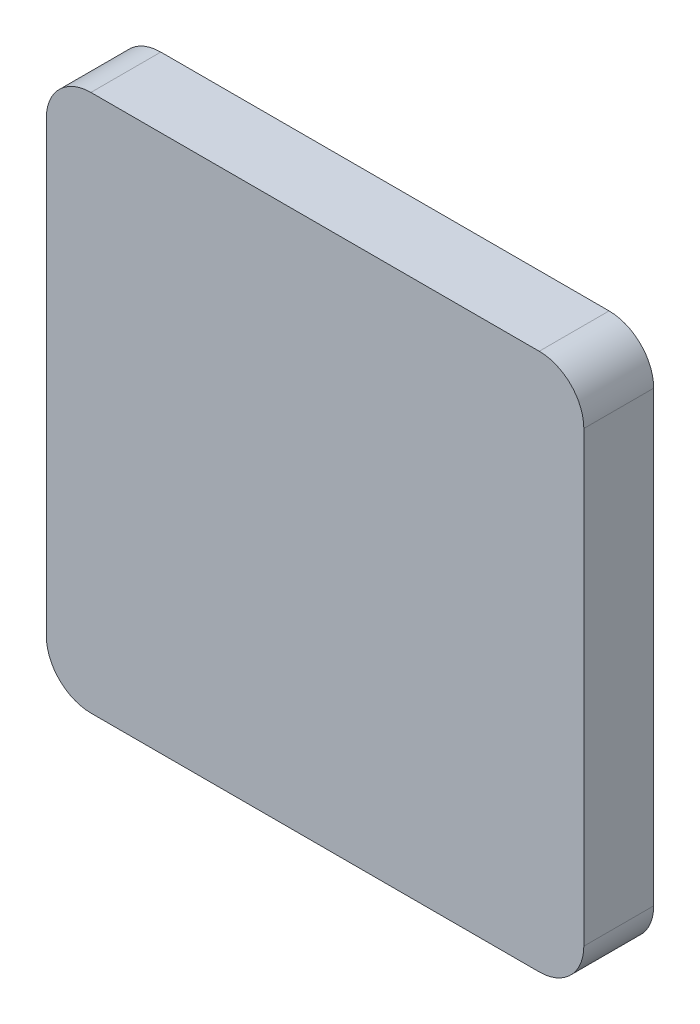
ISO-10303-21;
HEADER;
FILE_DESCRIPTION(('STEP AP214'),'2;1');
FILE_NAME('part.step','',(''),(''),'','','');
FILE_SCHEMA(('AUTOMOTIVE_DESIGN { 1 0 10303 214 1 1 1 1 }'));
ENDSEC;
DATA;
#1=APPLICATION_CONTEXT('core data for automotive mechanical design processes');
#2=APPLICATION_PROTOCOL_DEFINITION('international standard','automotive_design',2000,#1);
#3=PRODUCT_CONTEXT('',#1,'mechanical');
#4=PRODUCT('Part','Part','',(#3));
#5=PRODUCT_RELATED_PRODUCT_CATEGORY('part','',(#4));
#6=PRODUCT_DEFINITION_FORMATION('','',#4);
#7=PRODUCT_DEFINITION_CONTEXT('part definition',#1,'design');
#8=PRODUCT_DEFINITION('design','',#6,#7);
#9=PRODUCT_DEFINITION_SHAPE('','',#8);
#10=(LENGTH_UNIT() NAMED_UNIT(*) SI_UNIT(.MILLI.,.METRE.));
#11=(NAMED_UNIT(*) PLANE_ANGLE_UNIT() SI_UNIT($,.RADIAN.));
#12=(NAMED_UNIT(*) SI_UNIT($,.STERADIAN.) SOLID_ANGLE_UNIT());
#13=UNCERTAINTY_MEASURE_WITH_UNIT(LENGTH_MEASURE(1.E-05),#10,'distance_accuracy_value','');
#14=(GEOMETRIC_REPRESENTATION_CONTEXT(3) GLOBAL_UNCERTAINTY_ASSIGNED_CONTEXT((#13)) GLOBAL_UNIT_ASSIGNED_CONTEXT((#10,
#11,#12)) REPRESENTATION_CONTEXT('',''));
#15=CARTESIAN_POINT('',(0.,0.,0.));
#16=DIRECTION('',(0.,0.,1.));
#17=DIRECTION('',(1.,0.,0.));
#18=AXIS2_PLACEMENT_3D('',#15,#16,#17);
#19=CARTESIAN_POINT('',(-10.5918,-10.5918,3.302));
#20=DIRECTION('',(0.,0.,-1.));
#21=DIRECTION('',(-1.,0.,0.));
#22=AXIS2_PLACEMENT_3D('',#19,#20,#21);
#23=CYLINDRICAL_SURFACE('',#22,2.1082);
#24=CARTESIAN_POINT('',(-10.5918,-10.5918,0.));
#25=DIRECTION('',(0.,0.,1.));
#26=DIRECTION('',(1.,0.,0.));
#27=AXIS2_PLACEMENT_3D('',#24,#25,#26);
#28=CIRCLE('',#27,2.1082);
#29=CARTESIAN_POINT('',(-12.7,-10.5918,0.));
#30=VERTEX_POINT('',#29);
#31=CARTESIAN_POINT('',(-10.5918,-12.7,0.));
#32=VERTEX_POINT('',#31);
#33=EDGE_CURVE('E140',#30,#32,#28,.T.);
#34=ORIENTED_EDGE('',*,*,#33,.T.);
#35=DIRECTION('',(0.,0.,-1.));
#36=VECTOR('',#35,1.);
#37=CARTESIAN_POINT('',(-10.5918,-12.7,3.302));
#38=LINE('',#37,#36);
#39=CARTESIAN_POINT('',(-10.5918,-12.7,3.302));
#40=VERTEX_POINT('',#39);
#41=EDGE_CURVE('E11',#40,#32,#38,.T.);
#42=ORIENTED_EDGE('',*,*,#41,.F.);
#43=CARTESIAN_POINT('',(-10.5918,-10.5918,3.302));
#44=DIRECTION('',(0.,0.,1.));
#45=DIRECTION('',(1.,0.,0.));
#46=AXIS2_PLACEMENT_3D('',#43,#44,#45);
#47=CIRCLE('',#46,2.1082);
#48=CARTESIAN_POINT('',(-12.7,-10.5918,3.302));
#49=VERTEX_POINT('',#48);
#50=EDGE_CURVE('E162',#49,#40,#47,.T.);
#51=ORIENTED_EDGE('',*,*,#50,.F.);
#52=DIRECTION('',(0.,0.,-1.));
#53=VECTOR('',#52,1.);
#54=CARTESIAN_POINT('',(-12.7,-10.5918,3.302));
#55=LINE('',#54,#53);
#56=EDGE_CURVE('E136',#49,#30,#55,.T.);
#57=ORIENTED_EDGE('',*,*,#56,.T.);
#58=EDGE_LOOP('',(#34,#42,#51,#57));
#59=FACE_BOUND('',#58,.T.);
#60=ADVANCED_FACE('F39',(#59),#23,.T.);
#61=CARTESIAN_POINT('',(-10.5918,-12.7,3.302));
#62=DIRECTION('',(0.,1.,0.));
#63=DIRECTION('',(-1.,0.,0.));
#64=AXIS2_PLACEMENT_3D('',#61,#62,#63);
#65=PLANE('',#64);
#66=DIRECTION('',(1.,0.,0.));
#67=VECTOR('',#66,1.);
#68=CARTESIAN_POINT('',(-10.5918,-12.7,0.));
#69=LINE('',#68,#67);
#70=CARTESIAN_POINT('',(10.5918,-12.7,0.));
#71=VERTEX_POINT('',#70);
#72=EDGE_CURVE('E144',#32,#71,#69,.T.);
#73=ORIENTED_EDGE('',*,*,#72,.T.);
#74=DIRECTION('',(0.,0.,-1.));
#75=VECTOR('',#74,1.);
#76=CARTESIAN_POINT('',(10.5918,-12.7,3.302));
#77=LINE('',#76,#75);
#78=CARTESIAN_POINT('',(10.5918,-12.7,3.302));
#79=VERTEX_POINT('',#78);
#80=EDGE_CURVE('E48',#79,#71,#77,.T.);
#81=ORIENTED_EDGE('',*,*,#80,.F.);
#82=DIRECTION('',(1.,0.,0.));
#83=VECTOR('',#82,1.);
#84=CARTESIAN_POINT('',(-10.5918,-12.7,3.302));
#85=LINE('',#84,#83);
#86=EDGE_CURVE('E99',#40,#79,#85,.T.);
#87=ORIENTED_EDGE('',*,*,#86,.F.);
#88=ORIENTED_EDGE('',*,*,#41,.T.);
#89=EDGE_LOOP('',(#73,#81,#87,#88));
#90=FACE_BOUND('',#89,.T.);
#91=ADVANCED_FACE('F208',(#90),#65,.F.);
#92=CARTESIAN_POINT('',(10.5918,-10.5918,3.302));
#93=DIRECTION('',(0.,0.,-1.));
#94=DIRECTION('',(-1.,0.,0.));
#95=AXIS2_PLACEMENT_3D('',#92,#93,#94);
#96=CYLINDRICAL_SURFACE('',#95,2.10819999999999);
#97=CARTESIAN_POINT('',(10.5918,-10.5918,0.));
#98=DIRECTION('',(0.,0.,1.));
#99=DIRECTION('',(1.,0.,0.));
#100=AXIS2_PLACEMENT_3D('',#97,#98,#99);
#101=CIRCLE('',#100,2.10819999999999);
#102=CARTESIAN_POINT('',(12.7,-10.5918,0.));
#103=VERTEX_POINT('',#102);
#104=EDGE_CURVE('E147',#71,#103,#101,.T.);
#105=ORIENTED_EDGE('',*,*,#104,.T.);
#106=DIRECTION('',(0.,0.,-1.));
#107=VECTOR('',#106,1.);
#108=CARTESIAN_POINT('',(12.7,-10.5918,3.302));
#109=LINE('',#108,#107);
#110=CARTESIAN_POINT('',(12.7,-10.5918,3.302));
#111=VERTEX_POINT('',#110);
#112=EDGE_CURVE('E173',#111,#103,#109,.T.);
#113=ORIENTED_EDGE('',*,*,#112,.F.);
#114=CARTESIAN_POINT('',(10.5918,-10.5918,3.302));
#115=DIRECTION('',(0.,0.,1.));
#116=DIRECTION('',(1.,0.,0.));
#117=AXIS2_PLACEMENT_3D('',#114,#115,#116);
#118=CIRCLE('',#117,2.10819999999999);
#119=EDGE_CURVE('E183',#79,#111,#118,.T.);
#120=ORIENTED_EDGE('',*,*,#119,.F.);
#121=ORIENTED_EDGE('',*,*,#80,.T.);
#122=EDGE_LOOP('',(#105,#113,#120,#121));
#123=FACE_BOUND('',#122,.T.);
#124=ADVANCED_FACE('F181',(#123),#96,.T.);
#125=CARTESIAN_POINT('',(12.7,-10.5918,3.302));
#126=DIRECTION('',(-1.,0.,0.));
#127=DIRECTION('',(0.,0.,1.));
#128=AXIS2_PLACEMENT_3D('',#125,#126,#127);
#129=PLANE('',#128);
#130=DIRECTION('',(0.,1.,0.));
#131=VECTOR('',#130,1.);
#132=CARTESIAN_POINT('',(12.7,-10.5918,0.));
#133=LINE('',#132,#131);
#134=CARTESIAN_POINT('',(12.7,10.5918,0.));
#135=VERTEX_POINT('',#134);
#136=EDGE_CURVE('E150',#103,#135,#133,.T.);
#137=ORIENTED_EDGE('',*,*,#136,.T.);
#138=DIRECTION('',(0.,0.,-1.));
#139=VECTOR('',#138,1.);
#140=CARTESIAN_POINT('',(12.7,10.5918,3.302));
#141=LINE('',#140,#139);
#142=CARTESIAN_POINT('',(12.7,10.5918,3.302));
#143=VERTEX_POINT('',#142);
#144=EDGE_CURVE('E169',#143,#135,#141,.T.);
#145=ORIENTED_EDGE('',*,*,#144,.F.);
#146=DIRECTION('',(0.,1.,0.));
#147=VECTOR('',#146,1.);
#148=CARTESIAN_POINT('',(12.7,-10.5918,3.302));
#149=LINE('',#148,#147);
#150=EDGE_CURVE('E196',#111,#143,#149,.T.);
#151=ORIENTED_EDGE('',*,*,#150,.F.);
#152=ORIENTED_EDGE('',*,*,#112,.T.);
#153=EDGE_LOOP('',(#137,#145,#151,#152));
#154=FACE_BOUND('',#153,.T.);
#155=ADVANCED_FACE('F191',(#154),#129,.F.);
#156=CARTESIAN_POINT('',(10.5918,10.5918,3.302));
#157=DIRECTION('',(0.,0.,-1.));
#158=DIRECTION('',(-1.,0.,0.));
#159=AXIS2_PLACEMENT_3D('',#156,#157,#158);
#160=CYLINDRICAL_SURFACE('',#159,2.1082);
#161=CARTESIAN_POINT('',(10.5918,10.5918,0.));
#162=DIRECTION('',(0.,0.,1.));
#163=DIRECTION('',(1.,0.,0.));
#164=AXIS2_PLACEMENT_3D('',#161,#162,#163);
#165=CIRCLE('',#164,2.1082);
#166=CARTESIAN_POINT('',(10.5918,12.7,0.));
#167=VERTEX_POINT('',#166);
#168=EDGE_CURVE('E153',#135,#167,#165,.T.);
#169=ORIENTED_EDGE('',*,*,#168,.T.);
#170=DIRECTION('',(0.,0.,-1.));
#171=VECTOR('',#170,1.);
#172=CARTESIAN_POINT('',(10.5918,12.7,3.302));
#173=LINE('',#172,#171);
#174=CARTESIAN_POINT('',(10.5918,12.7,3.302));
#175=VERTEX_POINT('',#174);
#176=EDGE_CURVE('E129',#175,#167,#173,.T.);
#177=ORIENTED_EDGE('',*,*,#176,.F.);
#178=CARTESIAN_POINT('',(10.5918,10.5918,3.302));
#179=DIRECTION('',(0.,0.,1.));
#180=DIRECTION('',(1.,0.,0.));
#181=AXIS2_PLACEMENT_3D('',#178,#179,#180);
#182=CIRCLE('',#181,2.1082);
#183=EDGE_CURVE('E118',#143,#175,#182,.T.);
#184=ORIENTED_EDGE('',*,*,#183,.F.);
#185=ORIENTED_EDGE('',*,*,#144,.T.);
#186=EDGE_LOOP('',(#169,#177,#184,#185));
#187=FACE_BOUND('',#186,.T.);
#188=ADVANCED_FACE('F194',(#187),#160,.T.);
#189=CARTESIAN_POINT('',(10.5918,12.7,3.302));
#190=DIRECTION('',(0.,-1.,0.));
#191=DIRECTION('',(1.,0.,0.));
#192=AXIS2_PLACEMENT_3D('',#189,#190,#191);
#193=PLANE('',#192);
#194=DIRECTION('',(-1.,0.,0.));
#195=VECTOR('',#194,1.);
#196=CARTESIAN_POINT('',(10.5918,12.7,0.));
#197=LINE('',#196,#195);
#198=CARTESIAN_POINT('',(-10.5918,12.7,0.));
#199=VERTEX_POINT('',#198);
#200=EDGE_CURVE('E127',#167,#199,#197,.T.);
#201=ORIENTED_EDGE('',*,*,#200,.T.);
#202=DIRECTION('',(0.,0.,-1.));
#203=VECTOR('',#202,1.);
#204=CARTESIAN_POINT('',(-10.5918,12.7,3.302));
#205=LINE('',#204,#203);
#206=CARTESIAN_POINT('',(-10.5918,12.7,3.302));
#207=VERTEX_POINT('',#206);
#208=EDGE_CURVE('E124',#207,#199,#205,.T.);
#209=ORIENTED_EDGE('',*,*,#208,.F.);
#210=DIRECTION('',(-1.,0.,0.));
#211=VECTOR('',#210,1.);
#212=CARTESIAN_POINT('',(10.5918,12.7,3.302));
#213=LINE('',#212,#211);
#214=EDGE_CURVE('E112',#175,#207,#213,.T.);
#215=ORIENTED_EDGE('',*,*,#214,.F.);
#216=ORIENTED_EDGE('',*,*,#176,.T.);
#217=EDGE_LOOP('',(#201,#209,#215,#216));
#218=FACE_BOUND('',#217,.T.);
#219=ADVANCED_FACE('F125',(#218),#193,.F.);
#220=CARTESIAN_POINT('',(-10.5918,10.5918,3.302));
#221=DIRECTION('',(0.,0.,-1.));
#222=DIRECTION('',(-1.,0.,0.));
#223=AXIS2_PLACEMENT_3D('',#220,#221,#222);
#224=CYLINDRICAL_SURFACE('',#223,2.1082);
#225=CARTESIAN_POINT('',(-10.5918,10.5918,0.));
#226=DIRECTION('',(0.,0.,1.));
#227=DIRECTION('',(1.,0.,0.));
#228=AXIS2_PLACEMENT_3D('',#225,#226,#227);
#229=CIRCLE('',#228,2.1082);
#230=CARTESIAN_POINT('',(-12.7,10.5918,0.));
#231=VERTEX_POINT('',#230);
#232=EDGE_CURVE('E85',#199,#231,#229,.T.);
#233=ORIENTED_EDGE('',*,*,#232,.T.);
#234=DIRECTION('',(0.,0.,-1.));
#235=VECTOR('',#234,1.);
#236=CARTESIAN_POINT('',(-12.7,10.5918,3.302));
#237=LINE('',#236,#235);
#238=CARTESIAN_POINT('',(-12.7,10.5918,3.302));
#239=VERTEX_POINT('',#238);
#240=EDGE_CURVE('E130',#239,#231,#237,.T.);
#241=ORIENTED_EDGE('',*,*,#240,.F.);
#242=CARTESIAN_POINT('',(-10.5918,10.5918,3.302));
#243=DIRECTION('',(0.,0.,1.));
#244=DIRECTION('',(1.,0.,0.));
#245=AXIS2_PLACEMENT_3D('',#242,#243,#244);
#246=CIRCLE('',#245,2.1082);
#247=EDGE_CURVE('E116',#207,#239,#246,.T.);
#248=ORIENTED_EDGE('',*,*,#247,.F.);
#249=ORIENTED_EDGE('',*,*,#208,.T.);
#250=EDGE_LOOP('',(#233,#241,#248,#249));
#251=FACE_BOUND('',#250,.T.);
#252=ADVANCED_FACE('F132',(#251),#224,.T.);
#253=CARTESIAN_POINT('',(-12.7,10.5918,3.302));
#254=DIRECTION('',(1.,0.,0.));
#255=DIRECTION('',(0.,1.,0.));
#256=AXIS2_PLACEMENT_3D('',#253,#254,#255);
#257=PLANE('',#256);
#258=DIRECTION('',(0.,-1.,0.));
#259=VECTOR('',#258,1.);
#260=CARTESIAN_POINT('',(-12.7,10.5918,0.));
#261=LINE('',#260,#259);
#262=EDGE_CURVE('E91',#231,#30,#261,.T.);
#263=ORIENTED_EDGE('',*,*,#262,.T.);
#264=ORIENTED_EDGE('',*,*,#56,.F.);
#265=DIRECTION('',(0.,-1.,0.));
#266=VECTOR('',#265,1.);
#267=CARTESIAN_POINT('',(-12.7,10.5918,3.302));
#268=LINE('',#267,#266);
#269=EDGE_CURVE('E56',#239,#49,#268,.T.);
#270=ORIENTED_EDGE('',*,*,#269,.F.);
#271=ORIENTED_EDGE('',*,*,#240,.T.);
#272=EDGE_LOOP('',(#263,#264,#270,#271));
#273=FACE_BOUND('',#272,.T.);
#274=ADVANCED_FACE('F224',(#273),#257,.F.);
#275=CARTESIAN_POINT('',(-10.5918,-10.5918,3.302));
#276=DIRECTION('',(0.,0.,1.));
#277=DIRECTION('',(1.,0.,0.));
#278=AXIS2_PLACEMENT_3D('',#275,#276,#277);
#279=PLANE('',#278);
#280=ORIENTED_EDGE('',*,*,#50,.T.);
#281=ORIENTED_EDGE('',*,*,#86,.T.);
#282=ORIENTED_EDGE('',*,*,#119,.T.);
#283=ORIENTED_EDGE('',*,*,#150,.T.);
#284=ORIENTED_EDGE('',*,*,#183,.T.);
#285=ORIENTED_EDGE('',*,*,#214,.T.);
#286=ORIENTED_EDGE('',*,*,#247,.T.);
#287=ORIENTED_EDGE('',*,*,#269,.T.);
#288=EDGE_LOOP('',(#280,#281,#282,#283,#284,#285,#286,#287));
#289=FACE_BOUND('',#288,.T.);
#290=ADVANCED_FACE('F114',(#289),#279,.T.);
#291=CARTESIAN_POINT('',(-10.5918,-10.5918,0.));
#292=DIRECTION('',(0.,0.,1.));
#293=DIRECTION('',(1.,0.,0.));
#294=AXIS2_PLACEMENT_3D('',#291,#292,#293);
#295=PLANE('',#294);
#296=ORIENTED_EDGE('',*,*,#33,.F.);
#297=ORIENTED_EDGE('',*,*,#262,.F.);
#298=ORIENTED_EDGE('',*,*,#232,.F.);
#299=ORIENTED_EDGE('',*,*,#200,.F.);
#300=ORIENTED_EDGE('',*,*,#168,.F.);
#301=ORIENTED_EDGE('',*,*,#136,.F.);
#302=ORIENTED_EDGE('',*,*,#104,.F.);
#303=ORIENTED_EDGE('',*,*,#72,.F.);
#304=EDGE_LOOP('',(#296,#297,#298,#299,#300,#301,#302,#303));
#305=FACE_BOUND('',#304,.T.);
#306=ADVANCED_FACE('F187',(#305),#295,.F.);
#307=CLOSED_SHELL('',(#60,#91,#124,#155,#188,#219,#252,#274,#290,#306));
#308=MANIFOLD_SOLID_BREP('B2',#307);
#309=ADVANCED_BREP_SHAPE_REPRESENTATION('',(#18,#308),#14);
#310=SHAPE_DEFINITION_REPRESENTATION(#9,#309);
ENDSEC;
END-ISO-10303-21;
